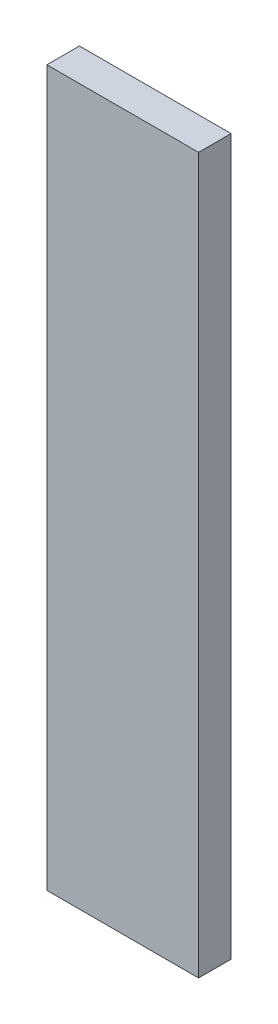
ISO-10303-21;
HEADER;
FILE_DESCRIPTION(('STEP AP214'),'2;1');
FILE_NAME('part.step','',(''),(''),'','','');
FILE_SCHEMA(('AUTOMOTIVE_DESIGN { 1 0 10303 214 1 1 1 1 }'));
ENDSEC;
DATA;
#1=APPLICATION_CONTEXT('core data for automotive mechanical design processes');
#2=APPLICATION_PROTOCOL_DEFINITION('international standard','automotive_design',2000,#1);
#3=PRODUCT_CONTEXT('',#1,'mechanical');
#4=PRODUCT('Part','Part','',(#3));
#5=PRODUCT_RELATED_PRODUCT_CATEGORY('part','',(#4));
#6=PRODUCT_DEFINITION_FORMATION('','',#4);
#7=PRODUCT_DEFINITION_CONTEXT('part definition',#1,'design');
#8=PRODUCT_DEFINITION('design','',#6,#7);
#9=PRODUCT_DEFINITION_SHAPE('','',#8);
#10=(LENGTH_UNIT() NAMED_UNIT(*) SI_UNIT(.MILLI.,.METRE.));
#11=(NAMED_UNIT(*) PLANE_ANGLE_UNIT() SI_UNIT($,.RADIAN.));
#12=(NAMED_UNIT(*) SI_UNIT($,.STERADIAN.) SOLID_ANGLE_UNIT());
#13=UNCERTAINTY_MEASURE_WITH_UNIT(LENGTH_MEASURE(1.E-05),#10,'distance_accuracy_value','');
#14=(GEOMETRIC_REPRESENTATION_CONTEXT(3) GLOBAL_UNCERTAINTY_ASSIGNED_CONTEXT((#13)) GLOBAL_UNIT_ASSIGNED_CONTEXT((#10,
#11,#12)) REPRESENTATION_CONTEXT('',''));
#15=CARTESIAN_POINT('',(0.,0.,0.));
#16=DIRECTION('',(0.,0.,1.));
#17=DIRECTION('',(1.,0.,0.));
#18=AXIS2_PLACEMENT_3D('',#15,#16,#17);
#19=CARTESIAN_POINT('',(0.,419.1,0.));
#20=DIRECTION('',(1.,0.,0.));
#21=DIRECTION('',(0.,0.,-1.));
#22=AXIS2_PLACEMENT_3D('',#19,#20,#21);
#23=PLANE('',#22);
#24=DIRECTION('',(0.,0.,1.));
#25=VECTOR('',#24,1.);
#26=CARTESIAN_POINT('',(0.,0.,0.));
#27=LINE('',#26,#25);
#28=CARTESIAN_POINT('',(0.,0.,-19.05));
#29=VERTEX_POINT('',#28);
#30=CARTESIAN_POINT('',(0.,0.,0.));
#31=VERTEX_POINT('',#30);
#32=EDGE_CURVE('E102',#29,#31,#27,.T.);
#33=ORIENTED_EDGE('',*,*,#32,.T.);
#34=DIRECTION('',(0.,-1.,0.));
#35=VECTOR('',#34,1.);
#36=CARTESIAN_POINT('',(0.,419.1,0.));
#37=LINE('',#36,#35);
#38=CARTESIAN_POINT('',(0.,419.1,0.));
#39=VERTEX_POINT('',#38);
#40=EDGE_CURVE('E11',#39,#31,#37,.T.);
#41=ORIENTED_EDGE('',*,*,#40,.F.);
#42=DIRECTION('',(0.,0.,1.));
#43=VECTOR('',#42,1.);
#44=CARTESIAN_POINT('',(0.,419.1,0.));
#45=LINE('',#44,#43);
#46=CARTESIAN_POINT('',(0.,419.1,-19.05));
#47=VERTEX_POINT('',#46);
#48=EDGE_CURVE('E90',#47,#39,#45,.T.);
#49=ORIENTED_EDGE('',*,*,#48,.F.);
#50=DIRECTION('',(0.,-1.,0.));
#51=VECTOR('',#50,1.);
#52=CARTESIAN_POINT('',(0.,419.1,-19.05));
#53=LINE('',#52,#51);
#54=EDGE_CURVE('E98',#47,#29,#53,.T.);
#55=ORIENTED_EDGE('',*,*,#54,.T.);
#56=EDGE_LOOP('',(#33,#41,#49,#55));
#57=FACE_BOUND('',#56,.T.);
#58=ADVANCED_FACE('F39',(#57),#23,.F.);
#59=CARTESIAN_POINT('',(0.,419.1,0.));
#60=DIRECTION('',(0.,0.,-1.));
#61=DIRECTION('',(-1.,0.,0.));
#62=AXIS2_PLACEMENT_3D('',#59,#60,#61);
#63=PLANE('',#62);
#64=DIRECTION('',(1.,0.,0.));
#65=VECTOR('',#64,1.);
#66=CARTESIAN_POINT('',(0.,0.,0.));
#67=LINE('',#66,#65);
#68=CARTESIAN_POINT('',(88.9,0.,0.));
#69=VERTEX_POINT('',#68);
#70=EDGE_CURVE('E94',#31,#69,#67,.T.);
#71=ORIENTED_EDGE('',*,*,#70,.T.);
#72=DIRECTION('',(0.,-1.,0.));
#73=VECTOR('',#72,1.);
#74=CARTESIAN_POINT('',(88.9,419.1,0.));
#75=LINE('',#74,#73);
#76=CARTESIAN_POINT('',(88.9,419.1,0.));
#77=VERTEX_POINT('',#76);
#78=EDGE_CURVE('E47',#77,#69,#75,.T.);
#79=ORIENTED_EDGE('',*,*,#78,.F.);
#80=DIRECTION('',(1.,0.,0.));
#81=VECTOR('',#80,1.);
#82=CARTESIAN_POINT('',(0.,419.1,0.));
#83=LINE('',#82,#81);
#84=EDGE_CURVE('E85',#39,#77,#83,.T.);
#85=ORIENTED_EDGE('',*,*,#84,.F.);
#86=ORIENTED_EDGE('',*,*,#40,.T.);
#87=EDGE_LOOP('',(#71,#79,#85,#86));
#88=FACE_BOUND('',#87,.T.);
#89=ADVANCED_FACE('F93',(#88),#63,.F.);
#90=CARTESIAN_POINT('',(88.9,419.1,0.));
#91=DIRECTION('',(-1.,0.,0.));
#92=DIRECTION('',(0.,0.,1.));
#93=AXIS2_PLACEMENT_3D('',#90,#91,#92);
#94=PLANE('',#93);
#95=DIRECTION('',(0.,0.,-1.));
#96=VECTOR('',#95,1.);
#97=CARTESIAN_POINT('',(88.9,0.,0.));
#98=LINE('',#97,#96);
#99=CARTESIAN_POINT('',(88.9,0.,-19.05));
#100=VERTEX_POINT('',#99);
#101=EDGE_CURVE('E72',#69,#100,#98,.T.);
#102=ORIENTED_EDGE('',*,*,#101,.T.);
#103=DIRECTION('',(0.,-1.,0.));
#104=VECTOR('',#103,1.);
#105=CARTESIAN_POINT('',(88.9,419.1,-19.05));
#106=LINE('',#105,#104);
#107=CARTESIAN_POINT('',(88.9,419.1,-19.05));
#108=VERTEX_POINT('',#107);
#109=EDGE_CURVE('E95',#108,#100,#106,.T.);
#110=ORIENTED_EDGE('',*,*,#109,.F.);
#111=DIRECTION('',(0.,0.,-1.));
#112=VECTOR('',#111,1.);
#113=CARTESIAN_POINT('',(88.9,419.1,0.));
#114=LINE('',#113,#112);
#115=EDGE_CURVE('E88',#77,#108,#114,.T.);
#116=ORIENTED_EDGE('',*,*,#115,.F.);
#117=ORIENTED_EDGE('',*,*,#78,.T.);
#118=EDGE_LOOP('',(#102,#110,#116,#117));
#119=FACE_BOUND('',#118,.T.);
#120=ADVANCED_FACE('F96',(#119),#94,.F.);
#121=CARTESIAN_POINT('',(0.,419.1,-19.05));
#122=DIRECTION('',(0.,0.,1.));
#123=DIRECTION('',(1.,0.,0.));
#124=AXIS2_PLACEMENT_3D('',#121,#122,#123);
#125=PLANE('',#124);
#126=DIRECTION('',(-1.,0.,0.));
#127=VECTOR('',#126,1.);
#128=CARTESIAN_POINT('',(0.,0.,-19.05));
#129=LINE('',#128,#127);
#130=EDGE_CURVE('E78',#100,#29,#129,.T.);
#131=ORIENTED_EDGE('',*,*,#130,.T.);
#132=ORIENTED_EDGE('',*,*,#54,.F.);
#133=DIRECTION('',(-1.,0.,0.));
#134=VECTOR('',#133,1.);
#135=CARTESIAN_POINT('',(0.,419.1,-19.05));
#136=LINE('',#135,#134);
#137=EDGE_CURVE('E55',#108,#47,#136,.T.);
#138=ORIENTED_EDGE('',*,*,#137,.F.);
#139=ORIENTED_EDGE('',*,*,#109,.T.);
#140=EDGE_LOOP('',(#131,#132,#138,#139));
#141=FACE_BOUND('',#140,.T.);
#142=ADVANCED_FACE('F109',(#141),#125,.F.);
#143=CARTESIAN_POINT('',(0.,419.1,0.));
#144=DIRECTION('',(0.,-1.,0.));
#145=DIRECTION('',(0.,0.,-1.));
#146=AXIS2_PLACEMENT_3D('',#143,#144,#145);
#147=PLANE('',#146);
#148=ORIENTED_EDGE('',*,*,#48,.T.);
#149=ORIENTED_EDGE('',*,*,#84,.T.);
#150=ORIENTED_EDGE('',*,*,#115,.T.);
#151=ORIENTED_EDGE('',*,*,#137,.T.);
#152=EDGE_LOOP('',(#148,#149,#150,#151));
#153=FACE_BOUND('',#152,.T.);
#154=ADVANCED_FACE('F86',(#153),#147,.F.);
#155=CARTESIAN_POINT('',(0.,0.,0.));
#156=DIRECTION('',(0.,-1.,0.));
#157=DIRECTION('',(0.,0.,-1.));
#158=AXIS2_PLACEMENT_3D('',#155,#156,#157);
#159=PLANE('',#158);
#160=ORIENTED_EDGE('',*,*,#32,.F.);
#161=ORIENTED_EDGE('',*,*,#130,.F.);
#162=ORIENTED_EDGE('',*,*,#101,.F.);
#163=ORIENTED_EDGE('',*,*,#70,.F.);
#164=EDGE_LOOP('',(#160,#161,#162,#163));
#165=FACE_BOUND('',#164,.T.);
#166=ADVANCED_FACE('F112',(#165),#159,.T.);
#167=CLOSED_SHELL('',(#58,#89,#120,#142,#154,#166));
#168=MANIFOLD_SOLID_BREP('B2',#167);
#169=ADVANCED_BREP_SHAPE_REPRESENTATION('',(#18,#168),#14);
#170=SHAPE_DEFINITION_REPRESENTATION(#9,#169);
ENDSEC;
END-ISO-10303-21;
